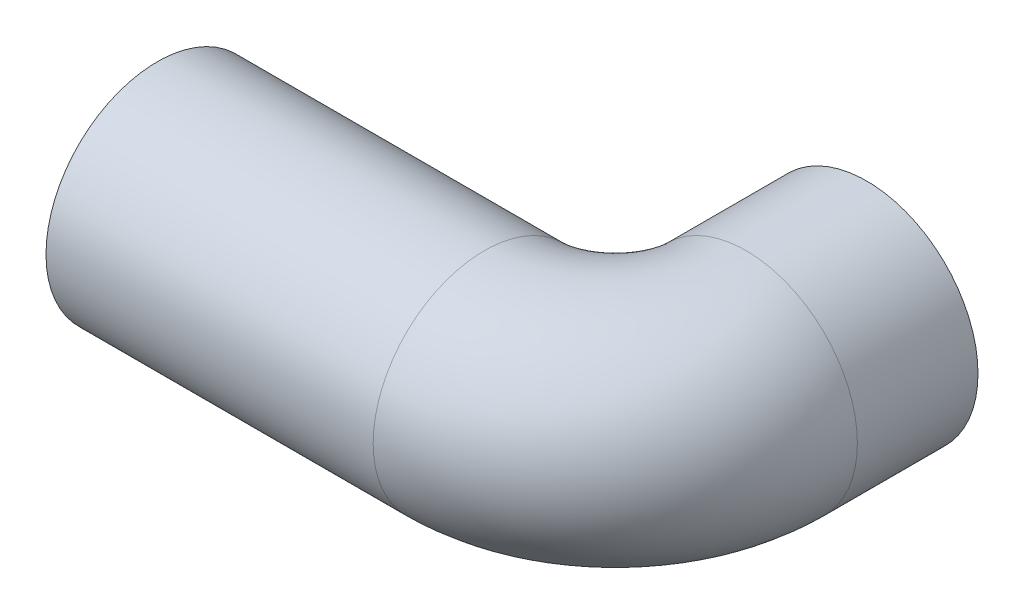
ISO-10303-21;
HEADER;
FILE_DESCRIPTION(('STEP AP214'),'2;1');
FILE_NAME('part.step','',(''),(''),'','','');
FILE_SCHEMA(('AUTOMOTIVE_DESIGN { 1 0 10303 214 1 1 1 1 }'));
ENDSEC;
DATA;
#1=APPLICATION_CONTEXT('core data for automotive mechanical design processes');
#2=APPLICATION_PROTOCOL_DEFINITION('international standard','automotive_design',2000,#1);
#3=PRODUCT_CONTEXT('',#1,'mechanical');
#4=PRODUCT('Part','Part','',(#3));
#5=PRODUCT_RELATED_PRODUCT_CATEGORY('part','',(#4));
#6=PRODUCT_DEFINITION_FORMATION('','',#4);
#7=PRODUCT_DEFINITION_CONTEXT('part definition',#1,'design');
#8=PRODUCT_DEFINITION('design','',#6,#7);
#9=PRODUCT_DEFINITION_SHAPE('','',#8);
#10=(LENGTH_UNIT() NAMED_UNIT(*) SI_UNIT(.MILLI.,.METRE.));
#11=(NAMED_UNIT(*) PLANE_ANGLE_UNIT() SI_UNIT($,.RADIAN.));
#12=(NAMED_UNIT(*) SI_UNIT($,.STERADIAN.) SOLID_ANGLE_UNIT());
#13=UNCERTAINTY_MEASURE_WITH_UNIT(LENGTH_MEASURE(1.E-05),#10,'distance_accuracy_value','');
#14=(GEOMETRIC_REPRESENTATION_CONTEXT(3) GLOBAL_UNCERTAINTY_ASSIGNED_CONTEXT((#13)) GLOBAL_UNIT_ASSIGNED_CONTEXT((#10,
#11,#12)) REPRESENTATION_CONTEXT('',''));
#15=CARTESIAN_POINT('',(0.,0.,0.));
#16=DIRECTION('',(0.,0.,1.));
#17=DIRECTION('',(1.,0.,0.));
#18=AXIS2_PLACEMENT_3D('',#15,#16,#17);
#19=CARTESIAN_POINT('',(0.,0.,0.));
#20=DIRECTION('',(0.,0.,-1.));
#21=DIRECTION('',(-1.,0.,0.));
#22=AXIS2_PLACEMENT_3D('',#19,#20,#21);
#23=PLANE('',#22);
#24=CARTESIAN_POINT('',(0.,0.,0.));
#25=DIRECTION('',(0.,0.,-1.));
#26=DIRECTION('',(-1.,0.,0.));
#27=AXIS2_PLACEMENT_3D('',#24,#25,#26);
#28=CIRCLE('',#27,33.5);
#29=CARTESIAN_POINT('',(-33.5,0.,0.));
#30=VERTEX_POINT('',#29);
#31=EDGE_CURVE('E73',#30,#30,#28,.T.);
#32=ORIENTED_EDGE('',*,*,#31,.F.);
#33=EDGE_LOOP('',(#32));
#34=FACE_BOUND('',#33,.T.);
#35=CARTESIAN_POINT('',(0.,0.,0.));
#36=DIRECTION('',(0.,0.,-1.));
#37=DIRECTION('',(-1.,0.,0.));
#38=AXIS2_PLACEMENT_3D('',#35,#36,#37);
#39=CIRCLE('',#38,34.);
#40=CARTESIAN_POINT('',(-34.,0.,0.));
#41=VERTEX_POINT('',#40);
#42=EDGE_CURVE('E66',#41,#41,#39,.T.);
#43=ORIENTED_EDGE('',*,*,#42,.T.);
#44=EDGE_LOOP('',(#43));
#45=FACE_BOUND('',#44,.T.);
#46=ADVANCED_FACE('F49',(#34,#45),#23,.T.);
#47=CARTESIAN_POINT('',(-140.,0.,76.87));
#48=DIRECTION('',(1.,0.,0.));
#49=DIRECTION('',(0.,0.,-1.));
#50=AXIS2_PLACEMENT_3D('',#47,#48,#49);
#51=PLANE('',#50);
#52=CARTESIAN_POINT('',(-140.,0.,76.87));
#53=DIRECTION('',(1.,0.,0.));
#54=DIRECTION('',(0.,0.,-1.));
#55=AXIS2_PLACEMENT_3D('',#52,#53,#54);
#56=CIRCLE('',#55,34.);
#57=CARTESIAN_POINT('',(-140.,0.,42.87));
#58=VERTEX_POINT('',#57);
#59=EDGE_CURVE('E11',#58,#58,#56,.T.);
#60=ORIENTED_EDGE('',*,*,#59,.F.);
#61=EDGE_LOOP('',(#60));
#62=FACE_BOUND('',#61,.T.);
#63=ADVANCED_FACE('F111',(#62),#51,.F.);
#64=CARTESIAN_POINT('',(0.,0.,0.));
#65=DIRECTION('',(0.,0.,1.));
#66=DIRECTION('',(1.,0.,0.));
#67=AXIS2_PLACEMENT_3D('',#64,#65,#66);
#68=CYLINDRICAL_SURFACE('',#67,34.);
#69=CARTESIAN_POINT('',(0.,0.,36.87));
#70=DIRECTION('',(0.,0.,-1.));
#71=DIRECTION('',(-1.,0.,0.));
#72=AXIS2_PLACEMENT_3D('',#69,#70,#71);
#73=CIRCLE('',#72,34.);
#74=CARTESIAN_POINT('',(34.,0.,36.87));
#75=VERTEX_POINT('',#74);
#76=EDGE_CURVE('E61',#75,#75,#73,.T.);
#77=ORIENTED_EDGE('',*,*,#76,.T.);
#78=EDGE_LOOP('',(#77));
#79=FACE_BOUND('',#78,.T.);
#80=ORIENTED_EDGE('',*,*,#42,.F.);
#81=EDGE_LOOP('',(#80));
#82=FACE_BOUND('',#81,.T.);
#83=ADVANCED_FACE('F114',(#79,#82),#68,.T.);
#84=CARTESIAN_POINT('',(-40.,0.,36.87));
#85=DIRECTION('',(0.,-1.,0.));
#86=DIRECTION('',(0.,0.,-1.));
#87=AXIS2_PLACEMENT_3D('',#84,#85,#86);
#88=TOROIDAL_SURFACE('',#87,40.,34.);
#89=CARTESIAN_POINT('',(-40.,0.,76.87));
#90=DIRECTION('',(1.,0.,0.));
#91=DIRECTION('',(0.,0.,-1.));
#92=AXIS2_PLACEMENT_3D('',#89,#90,#91);
#93=CIRCLE('',#92,34.);
#94=CARTESIAN_POINT('',(-40.,0.,110.87));
#95=VERTEX_POINT('',#94);
#96=EDGE_CURVE('E56',#95,#95,#93,.T.);
#97=CARTESIAN_POINT('',(-40.,0.,36.87));
#98=DIRECTION('',(0.,-1.,0.));
#99=DIRECTION('',(0.,0.,-1.));
#100=AXIS2_PLACEMENT_3D('',#97,#98,#99);
#101=CIRCLE('',#100,74.);
#102=EDGE_CURVE('',#75,#95,#101,.T.);
#103=ORIENTED_EDGE('',*,*,#76,.F.);
#104=ORIENTED_EDGE('',*,*,#96,.T.);
#105=ORIENTED_EDGE('',*,*,#102,.T.);
#106=ORIENTED_EDGE('',*,*,#102,.F.);
#107=EDGE_LOOP('',(#103,#105,#104,#106));
#108=FACE_BOUND('',#107,.T.);
#109=ADVANCED_FACE('F116',(#108),#88,.T.);
#110=CARTESIAN_POINT('',(-40.,0.,76.87));
#111=DIRECTION('',(-1.,0.,0.));
#112=DIRECTION('',(0.,0.,1.));
#113=AXIS2_PLACEMENT_3D('',#110,#111,#112);
#114=CYLINDRICAL_SURFACE('',#113,34.);
#115=ORIENTED_EDGE('',*,*,#59,.T.);
#116=EDGE_LOOP('',(#115));
#117=FACE_BOUND('',#116,.T.);
#118=ORIENTED_EDGE('',*,*,#96,.F.);
#119=EDGE_LOOP('',(#118));
#120=FACE_BOUND('',#119,.T.);
#121=ADVANCED_FACE('F123',(#117,#120),#114,.T.);
#122=CARTESIAN_POINT('',(-139.5,0.,76.87));
#123=DIRECTION('',(1.,0.,0.));
#124=DIRECTION('',(0.,0.,-1.));
#125=AXIS2_PLACEMENT_3D('',#122,#123,#124);
#126=PLANE('',#125);
#127=CARTESIAN_POINT('',(-139.5,0.,76.87));
#128=DIRECTION('',(1.,0.,0.));
#129=DIRECTION('',(0.,0.,-1.));
#130=AXIS2_PLACEMENT_3D('',#127,#128,#129);
#131=CIRCLE('',#130,33.5);
#132=CARTESIAN_POINT('',(-139.5,0.,43.37));
#133=VERTEX_POINT('',#132);
#134=EDGE_CURVE('E72',#133,#133,#131,.T.);
#135=ORIENTED_EDGE('',*,*,#134,.T.);
#136=EDGE_LOOP('',(#135));
#137=FACE_BOUND('',#136,.T.);
#138=ADVANCED_FACE('F89',(#137),#126,.T.);
#139=CARTESIAN_POINT('',(0.,0.,0.));
#140=DIRECTION('',(0.,0.,1.));
#141=DIRECTION('',(1.,0.,0.));
#142=AXIS2_PLACEMENT_3D('',#139,#140,#141);
#143=CYLINDRICAL_SURFACE('',#142,33.5);
#144=CARTESIAN_POINT('',(0.,0.,36.87));
#145=DIRECTION('',(0.,0.,1.));
#146=DIRECTION('',(1.,0.,0.));
#147=AXIS2_PLACEMENT_3D('',#144,#145,#146);
#148=CIRCLE('',#147,33.5);
#149=CARTESIAN_POINT('',(33.5,0.,36.87));
#150=VERTEX_POINT('',#149);
#151=EDGE_CURVE('E77',#150,#150,#148,.F.);
#152=ORIENTED_EDGE('',*,*,#151,.F.);
#153=EDGE_LOOP('',(#152));
#154=FACE_BOUND('',#153,.T.);
#155=ORIENTED_EDGE('',*,*,#31,.T.);
#156=EDGE_LOOP('',(#155));
#157=FACE_BOUND('',#156,.T.);
#158=ADVANCED_FACE('F100',(#154,#157),#143,.F.);
#159=CARTESIAN_POINT('',(-40.,0.,36.87));
#160=DIRECTION('',(0.,-1.,0.));
#161=DIRECTION('',(0.,0.,-1.));
#162=AXIS2_PLACEMENT_3D('',#159,#160,#161);
#163=TOROIDAL_SURFACE('',#162,40.,33.5);
#164=CARTESIAN_POINT('',(-40.,0.,76.87));
#165=DIRECTION('',(1.,0.,0.));
#166=DIRECTION('',(0.,0.,-1.));
#167=AXIS2_PLACEMENT_3D('',#164,#165,#166);
#168=CIRCLE('',#167,33.5);
#169=CARTESIAN_POINT('',(-40.,0.,110.37));
#170=VERTEX_POINT('',#169);
#171=EDGE_CURVE('E81',#170,#170,#168,.T.);
#172=CARTESIAN_POINT('',(-40.,0.,36.87));
#173=DIRECTION('',(0.,-1.,0.));
#174=DIRECTION('',(0.,0.,-1.));
#175=AXIS2_PLACEMENT_3D('',#172,#173,#174);
#176=CIRCLE('',#175,73.5);
#177=EDGE_CURVE('',#150,#170,#176,.T.);
#178=ORIENTED_EDGE('',*,*,#151,.T.);
#179=ORIENTED_EDGE('',*,*,#171,.F.);
#180=ORIENTED_EDGE('',*,*,#177,.T.);
#181=ORIENTED_EDGE('',*,*,#177,.F.);
#182=EDGE_LOOP('',(#178,#180,#179,#181));
#183=FACE_BOUND('',#182,.T.);
#184=ADVANCED_FACE('F94',(#183),#163,.F.);
#185=CARTESIAN_POINT('',(-40.,0.,76.87));
#186=DIRECTION('',(-1.,0.,0.));
#187=DIRECTION('',(0.,0.,1.));
#188=AXIS2_PLACEMENT_3D('',#185,#186,#187);
#189=CYLINDRICAL_SURFACE('',#188,33.5);
#190=ORIENTED_EDGE('',*,*,#134,.F.);
#191=EDGE_LOOP('',(#190));
#192=FACE_BOUND('',#191,.T.);
#193=ORIENTED_EDGE('',*,*,#171,.T.);
#194=EDGE_LOOP('',(#193));
#195=FACE_BOUND('',#194,.T.);
#196=ADVANCED_FACE('F91',(#192,#195),#189,.F.);
#197=CLOSED_SHELL('',(#46,#63,#83,#109,#121,#138,#158,#184,#196));
#198=MANIFOLD_SOLID_BREP('B2',#197);
#199=ADVANCED_BREP_SHAPE_REPRESENTATION('',(#18,#198),#14);
#200=SHAPE_DEFINITION_REPRESENTATION(#9,#199);
ENDSEC;
END-ISO-10303-21;
